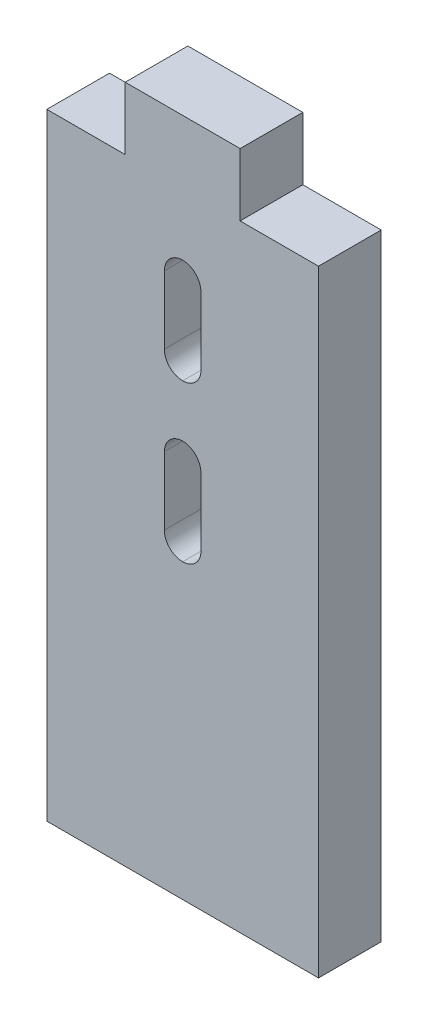
ISO-10303-21;
HEADER;
FILE_DESCRIPTION(('STEP AP214'),'2;1');
FILE_NAME('part.step','',(''),(''),'','','');
FILE_SCHEMA(('AUTOMOTIVE_DESIGN { 1 0 10303 214 1 1 1 1 }'));
ENDSEC;
DATA;
#1=APPLICATION_CONTEXT('core data for automotive mechanical design processes');
#2=APPLICATION_PROTOCOL_DEFINITION('international standard','automotive_design',2000,#1);
#3=PRODUCT_CONTEXT('',#1,'mechanical');
#4=PRODUCT('Part','Part','',(#3));
#5=PRODUCT_RELATED_PRODUCT_CATEGORY('part','',(#4));
#6=PRODUCT_DEFINITION_FORMATION('','',#4);
#7=PRODUCT_DEFINITION_CONTEXT('part definition',#1,'design');
#8=PRODUCT_DEFINITION('design','',#6,#7);
#9=PRODUCT_DEFINITION_SHAPE('','',#8);
#10=(LENGTH_UNIT() NAMED_UNIT(*) SI_UNIT(.MILLI.,.METRE.));
#11=(NAMED_UNIT(*) PLANE_ANGLE_UNIT() SI_UNIT($,.RADIAN.));
#12=(NAMED_UNIT(*) SI_UNIT($,.STERADIAN.) SOLID_ANGLE_UNIT());
#13=UNCERTAINTY_MEASURE_WITH_UNIT(LENGTH_MEASURE(1.E-05),#10,'distance_accuracy_value','');
#14=(GEOMETRIC_REPRESENTATION_CONTEXT(3) GLOBAL_UNCERTAINTY_ASSIGNED_CONTEXT((#13)) GLOBAL_UNIT_ASSIGNED_CONTEXT((#10,
#11,#12)) REPRESENTATION_CONTEXT('',''));
#15=CARTESIAN_POINT('',(0.,0.,0.));
#16=DIRECTION('',(0.,0.,1.));
#17=DIRECTION('',(1.,0.,0.));
#18=AXIS2_PLACEMENT_3D('',#15,#16,#17);
#19=CARTESIAN_POINT('',(1.75,0.,6.));
#20=DIRECTION('',(1.,0.,0.));
#21=DIRECTION('',(0.,1.,0.));
#22=AXIS2_PLACEMENT_3D('',#19,#20,#21);
#23=PLANE('',#22);
#24=DIRECTION('',(0.,-1.,0.));
#25=VECTOR('',#24,1.);
#26=CARTESIAN_POINT('',(1.75,0.,0.));
#27=LINE('',#26,#25);
#28=CARTESIAN_POINT('',(1.75,18.75,0.));
#29=VERTEX_POINT('',#28);
#30=CARTESIAN_POINT('',(1.75,12.25,0.));
#31=VERTEX_POINT('',#30);
#32=EDGE_CURVE('E250',#29,#31,#27,.T.);
#33=ORIENTED_EDGE('',*,*,#32,.T.);
#34=DIRECTION('',(0.,0.,-1.));
#35=VECTOR('',#34,1.);
#36=CARTESIAN_POINT('',(1.75,12.25,6.));
#37=LINE('',#36,#35);
#38=CARTESIAN_POINT('',(1.75,12.25,6.));
#39=VERTEX_POINT('',#38);
#40=EDGE_CURVE('E284',#31,#39,#37,.F.);
#41=ORIENTED_EDGE('',*,*,#40,.T.);
#42=DIRECTION('',(0.,-1.,0.));
#43=VECTOR('',#42,1.);
#44=CARTESIAN_POINT('',(1.75,0.,6.));
#45=LINE('',#44,#43);
#46=CARTESIAN_POINT('',(1.75,18.75,6.));
#47=VERTEX_POINT('',#46);
#48=EDGE_CURVE('E215',#47,#39,#45,.T.);
#49=ORIENTED_EDGE('',*,*,#48,.F.);
#50=DIRECTION('',(0.,0.,-1.));
#51=VECTOR('',#50,1.);
#52=CARTESIAN_POINT('',(1.75,18.75,6.));
#53=LINE('',#52,#51);
#54=EDGE_CURVE('E281',#47,#29,#53,.T.);
#55=ORIENTED_EDGE('',*,*,#54,.T.);
#56=EDGE_LOOP('',(#33,#41,#49,#55));
#57=FACE_BOUND('',#56,.T.);
#58=ADVANCED_FACE('F35',(#57),#23,.F.);
#59=CARTESIAN_POINT('',(-5.5,0.,6.));
#60=DIRECTION('',(-1.,0.,0.));
#61=DIRECTION('',(0.,0.,1.));
#62=AXIS2_PLACEMENT_3D('',#59,#60,#61);
#63=PLANE('',#62);
#64=DIRECTION('',(0.,1.,0.));
#65=VECTOR('',#64,1.);
#66=CARTESIAN_POINT('',(-5.5,0.,0.));
#67=LINE('',#66,#65);
#68=CARTESIAN_POINT('',(-5.5,26.5,0.));
#69=VERTEX_POINT('',#68);
#70=CARTESIAN_POINT('',(-5.5,32.5,0.));
#71=VERTEX_POINT('',#70);
#72=EDGE_CURVE('E178',#69,#71,#67,.T.);
#73=ORIENTED_EDGE('',*,*,#72,.F.);
#74=DIRECTION('',(0.,0.,-1.));
#75=VECTOR('',#74,1.);
#76=CARTESIAN_POINT('',(-5.5,26.5,6.));
#77=LINE('',#76,#75);
#78=CARTESIAN_POINT('',(-5.5,26.5,6.));
#79=VERTEX_POINT('',#78);
#80=EDGE_CURVE('E173',#79,#69,#77,.T.);
#81=ORIENTED_EDGE('',*,*,#80,.F.);
#82=DIRECTION('',(0.,1.,0.));
#83=VECTOR('',#82,1.);
#84=CARTESIAN_POINT('',(-5.5,0.,6.));
#85=LINE('',#84,#83);
#86=CARTESIAN_POINT('',(-5.5,32.5,6.));
#87=VERTEX_POINT('',#86);
#88=EDGE_CURVE('E176',#79,#87,#85,.T.);
#89=ORIENTED_EDGE('',*,*,#88,.T.);
#90=DIRECTION('',(0.,0.,-1.));
#91=VECTOR('',#90,1.);
#92=CARTESIAN_POINT('',(-5.5,32.5,6.));
#93=LINE('',#92,#91);
#94=EDGE_CURVE('E221',#87,#71,#93,.T.);
#95=ORIENTED_EDGE('',*,*,#94,.T.);
#96=EDGE_LOOP('',(#73,#81,#89,#95));
#97=FACE_BOUND('',#96,.T.);
#98=ADVANCED_FACE('F175',(#97),#63,.T.);
#99=CARTESIAN_POINT('',(0.,26.5,6.));
#100=DIRECTION('',(0.,1.,0.));
#101=DIRECTION('',(0.,0.,1.));
#102=AXIS2_PLACEMENT_3D('',#99,#100,#101);
#103=PLANE('',#102);
#104=DIRECTION('',(1.,0.,0.));
#105=VECTOR('',#104,1.);
#106=CARTESIAN_POINT('',(0.,26.5,0.));
#107=LINE('',#106,#105);
#108=CARTESIAN_POINT('',(-13.,26.5,0.));
#109=VERTEX_POINT('',#108);
#110=EDGE_CURVE('E230',#109,#69,#107,.T.);
#111=ORIENTED_EDGE('',*,*,#110,.F.);
#112=DIRECTION('',(0.,0.,-1.));
#113=VECTOR('',#112,1.);
#114=CARTESIAN_POINT('',(-13.,26.5,6.));
#115=LINE('',#114,#113);
#116=CARTESIAN_POINT('',(-13.,26.5,6.));
#117=VERTEX_POINT('',#116);
#118=EDGE_CURVE('E184',#117,#109,#115,.T.);
#119=ORIENTED_EDGE('',*,*,#118,.F.);
#120=DIRECTION('',(1.,0.,0.));
#121=VECTOR('',#120,1.);
#122=CARTESIAN_POINT('',(0.,26.5,6.));
#123=LINE('',#122,#121);
#124=EDGE_CURVE('E190',#117,#79,#123,.T.);
#125=ORIENTED_EDGE('',*,*,#124,.T.);
#126=ORIENTED_EDGE('',*,*,#80,.T.);
#127=EDGE_LOOP('',(#111,#119,#125,#126));
#128=FACE_BOUND('',#127,.T.);
#129=ADVANCED_FACE('F197',(#128),#103,.T.);
#130=CARTESIAN_POINT('',(-13.,0.,6.));
#131=DIRECTION('',(-1.,0.,0.));
#132=DIRECTION('',(0.,-1.,0.));
#133=AXIS2_PLACEMENT_3D('',#130,#131,#132);
#134=PLANE('',#133);
#135=DIRECTION('',(0.,1.,0.));
#136=VECTOR('',#135,1.);
#137=CARTESIAN_POINT('',(-13.,0.,0.));
#138=LINE('',#137,#136);
#139=CARTESIAN_POINT('',(-13.,-32.5,0.));
#140=VERTEX_POINT('',#139);
#141=EDGE_CURVE('E232',#140,#109,#138,.T.);
#142=ORIENTED_EDGE('',*,*,#141,.F.);
#143=DIRECTION('',(0.,0.,-1.));
#144=VECTOR('',#143,1.);
#145=CARTESIAN_POINT('',(-13.,-32.5,6.));
#146=LINE('',#145,#144);
#147=CARTESIAN_POINT('',(-13.,-32.5,6.));
#148=VERTEX_POINT('',#147);
#149=EDGE_CURVE('E269',#148,#140,#146,.T.);
#150=ORIENTED_EDGE('',*,*,#149,.F.);
#151=DIRECTION('',(0.,1.,0.));
#152=VECTOR('',#151,1.);
#153=CARTESIAN_POINT('',(-13.,0.,6.));
#154=LINE('',#153,#152);
#155=EDGE_CURVE('E198',#148,#117,#154,.T.);
#156=ORIENTED_EDGE('',*,*,#155,.T.);
#157=ORIENTED_EDGE('',*,*,#118,.T.);
#158=EDGE_LOOP('',(#142,#150,#156,#157));
#159=FACE_BOUND('',#158,.T.);
#160=ADVANCED_FACE('F388',(#159),#134,.T.);
#161=CARTESIAN_POINT('',(0.,-32.5,6.));
#162=DIRECTION('',(0.,-1.,0.));
#163=DIRECTION('',(0.,0.,-1.));
#164=AXIS2_PLACEMENT_3D('',#161,#162,#163);
#165=PLANE('',#164);
#166=DIRECTION('',(-1.,0.,0.));
#167=VECTOR('',#166,1.);
#168=CARTESIAN_POINT('',(0.,-32.5,0.));
#169=LINE('',#168,#167);
#170=CARTESIAN_POINT('',(13.,-32.5,0.));
#171=VERTEX_POINT('',#170);
#172=EDGE_CURVE('E235',#171,#140,#169,.T.);
#173=ORIENTED_EDGE('',*,*,#172,.F.);
#174=DIRECTION('',(0.,0.,-1.));
#175=VECTOR('',#174,1.);
#176=CARTESIAN_POINT('',(13.,-32.5,6.));
#177=LINE('',#176,#175);
#178=CARTESIAN_POINT('',(13.,-32.5,6.));
#179=VERTEX_POINT('',#178);
#180=EDGE_CURVE('E267',#179,#171,#177,.T.);
#181=ORIENTED_EDGE('',*,*,#180,.F.);
#182=DIRECTION('',(-1.,0.,0.));
#183=VECTOR('',#182,1.);
#184=CARTESIAN_POINT('',(0.,-32.5,6.));
#185=LINE('',#184,#183);
#186=EDGE_CURVE('E200',#179,#148,#185,.T.);
#187=ORIENTED_EDGE('',*,*,#186,.T.);
#188=ORIENTED_EDGE('',*,*,#149,.T.);
#189=EDGE_LOOP('',(#173,#181,#187,#188));
#190=FACE_BOUND('',#189,.T.);
#191=ADVANCED_FACE('F384',(#190),#165,.T.);
#192=CARTESIAN_POINT('',(13.,0.,6.));
#193=DIRECTION('',(-1.,0.,0.));
#194=DIRECTION('',(0.,-1.,0.));
#195=AXIS2_PLACEMENT_3D('',#192,#193,#194);
#196=PLANE('',#195);
#197=DIRECTION('',(0.,1.,0.));
#198=VECTOR('',#197,1.);
#199=CARTESIAN_POINT('',(13.,0.,0.));
#200=LINE('',#199,#198);
#201=CARTESIAN_POINT('',(13.,26.5,0.));
#202=VERTEX_POINT('',#201);
#203=EDGE_CURVE('E238',#171,#202,#200,.T.);
#204=ORIENTED_EDGE('',*,*,#203,.T.);
#205=DIRECTION('',(0.,0.,-1.));
#206=VECTOR('',#205,1.);
#207=CARTESIAN_POINT('',(13.,26.5,6.));
#208=LINE('',#207,#206);
#209=CARTESIAN_POINT('',(13.,26.5,6.));
#210=VERTEX_POINT('',#209);
#211=EDGE_CURVE('E264',#210,#202,#208,.T.);
#212=ORIENTED_EDGE('',*,*,#211,.F.);
#213=DIRECTION('',(0.,1.,0.));
#214=VECTOR('',#213,1.);
#215=CARTESIAN_POINT('',(13.,0.,6.));
#216=LINE('',#215,#214);
#217=EDGE_CURVE('E206',#179,#210,#216,.T.);
#218=ORIENTED_EDGE('',*,*,#217,.F.);
#219=ORIENTED_EDGE('',*,*,#180,.T.);
#220=EDGE_LOOP('',(#204,#212,#218,#219));
#221=FACE_BOUND('',#220,.T.);
#222=ADVANCED_FACE('F380',(#221),#196,.F.);
#223=CARTESIAN_POINT('',(0.,26.5,6.));
#224=DIRECTION('',(0.,-1.,0.));
#225=DIRECTION('',(1.,0.,0.));
#226=AXIS2_PLACEMENT_3D('',#223,#224,#225);
#227=PLANE('',#226);
#228=DIRECTION('',(-1.,0.,0.));
#229=VECTOR('',#228,1.);
#230=CARTESIAN_POINT('',(0.,26.5,0.));
#231=LINE('',#230,#229);
#232=CARTESIAN_POINT('',(5.5,26.5,0.));
#233=VERTEX_POINT('',#232);
#234=EDGE_CURVE('E241',#202,#233,#231,.T.);
#235=ORIENTED_EDGE('',*,*,#234,.T.);
#236=DIRECTION('',(0.,0.,-1.));
#237=VECTOR('',#236,1.);
#238=CARTESIAN_POINT('',(5.5,26.5,6.));
#239=LINE('',#238,#237);
#240=CARTESIAN_POINT('',(5.5,26.5,6.));
#241=VERTEX_POINT('',#240);
#242=EDGE_CURVE('E261',#241,#233,#239,.T.);
#243=ORIENTED_EDGE('',*,*,#242,.F.);
#244=DIRECTION('',(-1.,0.,0.));
#245=VECTOR('',#244,1.);
#246=CARTESIAN_POINT('',(0.,26.5,6.));
#247=LINE('',#246,#245);
#248=EDGE_CURVE('E209',#210,#241,#247,.T.);
#249=ORIENTED_EDGE('',*,*,#248,.F.);
#250=ORIENTED_EDGE('',*,*,#211,.T.);
#251=EDGE_LOOP('',(#235,#243,#249,#250));
#252=FACE_BOUND('',#251,.T.);
#253=ADVANCED_FACE('F376',(#252),#227,.F.);
#254=CARTESIAN_POINT('',(5.5,0.,6.));
#255=DIRECTION('',(-1.,0.,0.));
#256=DIRECTION('',(0.,0.,1.));
#257=AXIS2_PLACEMENT_3D('',#254,#255,#256);
#258=PLANE('',#257);
#259=DIRECTION('',(0.,1.,0.));
#260=VECTOR('',#259,1.);
#261=CARTESIAN_POINT('',(5.5,0.,0.));
#262=LINE('',#261,#260);
#263=CARTESIAN_POINT('',(5.5,32.5,0.));
#264=VERTEX_POINT('',#263);
#265=EDGE_CURVE('E244',#233,#264,#262,.T.);
#266=ORIENTED_EDGE('',*,*,#265,.T.);
#267=DIRECTION('',(0.,0.,-1.));
#268=VECTOR('',#267,1.);
#269=CARTESIAN_POINT('',(5.5,32.5,6.));
#270=LINE('',#269,#268);
#271=CARTESIAN_POINT('',(5.5,32.5,6.));
#272=VERTEX_POINT('',#271);
#273=EDGE_CURVE('E258',#272,#264,#270,.T.);
#274=ORIENTED_EDGE('',*,*,#273,.F.);
#275=DIRECTION('',(0.,1.,0.));
#276=VECTOR('',#275,1.);
#277=CARTESIAN_POINT('',(5.5,0.,6.));
#278=LINE('',#277,#276);
#279=EDGE_CURVE('E212',#241,#272,#278,.T.);
#280=ORIENTED_EDGE('',*,*,#279,.F.);
#281=ORIENTED_EDGE('',*,*,#242,.T.);
#282=EDGE_LOOP('',(#266,#274,#280,#281));
#283=FACE_BOUND('',#282,.T.);
#284=ADVANCED_FACE('F372',(#283),#258,.F.);
#285=CARTESIAN_POINT('',(-1.75,0.,6.));
#286=DIRECTION('',(1.,0.,0.));
#287=DIRECTION('',(0.,1.,0.));
#288=AXIS2_PLACEMENT_3D('',#285,#286,#287);
#289=PLANE('',#288);
#290=DIRECTION('',(0.,-1.,0.));
#291=VECTOR('',#290,1.);
#292=CARTESIAN_POINT('',(-1.75,0.,6.));
#293=LINE('',#292,#291);
#294=CARTESIAN_POINT('',(-1.75,3.74999999999997,6.));
#295=VERTEX_POINT('',#294);
#296=CARTESIAN_POINT('',(-1.75,-2.75000000000003,6.));
#297=VERTEX_POINT('',#296);
#298=EDGE_CURVE('E256',#295,#297,#293,.T.);
#299=ORIENTED_EDGE('',*,*,#298,.T.);
#300=DIRECTION('',(0.,0.,-1.));
#301=VECTOR('',#300,1.);
#302=CARTESIAN_POINT('',(-1.75,-2.75000000000003,6.));
#303=LINE('',#302,#301);
#304=CARTESIAN_POINT('',(-1.75,-2.75000000000003,0.));
#305=VERTEX_POINT('',#304);
#306=EDGE_CURVE('E273',#297,#305,#303,.T.);
#307=ORIENTED_EDGE('',*,*,#306,.T.);
#308=DIRECTION('',(0.,-1.,0.));
#309=VECTOR('',#308,1.);
#310=CARTESIAN_POINT('',(-1.75,0.,0.));
#311=LINE('',#310,#309);
#312=CARTESIAN_POINT('',(-1.75,3.74999999999997,0.));
#313=VERTEX_POINT('',#312);
#314=EDGE_CURVE('E222',#313,#305,#311,.T.);
#315=ORIENTED_EDGE('',*,*,#314,.F.);
#316=DIRECTION('',(0.,0.,-1.));
#317=VECTOR('',#316,1.);
#318=CARTESIAN_POINT('',(-1.75,3.74999999999997,6.));
#319=LINE('',#318,#317);
#320=EDGE_CURVE('E183',#313,#295,#319,.F.);
#321=ORIENTED_EDGE('',*,*,#320,.T.);
#322=EDGE_LOOP('',(#299,#307,#315,#321));
#323=FACE_BOUND('',#322,.T.);
#324=ADVANCED_FACE('F375',(#323),#289,.T.);
#325=CARTESIAN_POINT('',(1.75000000000001,0.,6.));
#326=DIRECTION('',(1.,0.,0.));
#327=DIRECTION('',(0.,1.,0.));
#328=AXIS2_PLACEMENT_3D('',#325,#326,#327);
#329=PLANE('',#328);
#330=DIRECTION('',(0.,-1.,0.));
#331=VECTOR('',#330,1.);
#332=CARTESIAN_POINT('',(1.75000000000001,0.,0.));
#333=LINE('',#332,#331);
#334=CARTESIAN_POINT('',(1.75000000000001,3.74999999999997,0.));
#335=VERTEX_POINT('',#334);
#336=CARTESIAN_POINT('',(1.75000000000001,-2.75000000000003,0.));
#337=VERTEX_POINT('',#336);
#338=EDGE_CURVE('E225',#335,#337,#333,.T.);
#339=ORIENTED_EDGE('',*,*,#338,.T.);
#340=DIRECTION('',(0.,0.,-1.));
#341=VECTOR('',#340,1.);
#342=CARTESIAN_POINT('',(1.75000000000001,-2.75000000000003,6.));
#343=LINE('',#342,#341);
#344=CARTESIAN_POINT('',(1.75000000000001,-2.75000000000003,6.));
#345=VERTEX_POINT('',#344);
#346=EDGE_CURVE('E279',#337,#345,#343,.F.);
#347=ORIENTED_EDGE('',*,*,#346,.T.);
#348=DIRECTION('',(0.,-1.,0.));
#349=VECTOR('',#348,1.);
#350=CARTESIAN_POINT('',(1.75000000000001,0.,6.));
#351=LINE('',#350,#349);
#352=CARTESIAN_POINT('',(1.75000000000001,3.74999999999997,6.));
#353=VERTEX_POINT('',#352);
#354=EDGE_CURVE('E195',#353,#345,#351,.T.);
#355=ORIENTED_EDGE('',*,*,#354,.F.);
#356=DIRECTION('',(0.,0.,-1.));
#357=VECTOR('',#356,1.);
#358=CARTESIAN_POINT('',(1.75000000000001,3.74999999999997,6.));
#359=LINE('',#358,#357);
#360=EDGE_CURVE('E276',#353,#335,#359,.T.);
#361=ORIENTED_EDGE('',*,*,#360,.T.);
#362=EDGE_LOOP('',(#339,#347,#355,#361));
#363=FACE_BOUND('',#362,.T.);
#364=ADVANCED_FACE('F370',(#363),#329,.F.);
#365=CARTESIAN_POINT('',(0.,32.5,6.));
#366=DIRECTION('',(0.,-1.,0.));
#367=DIRECTION('',(0.,0.,-1.));
#368=AXIS2_PLACEMENT_3D('',#365,#366,#367);
#369=PLANE('',#368);
#370=DIRECTION('',(-1.,0.,0.));
#371=VECTOR('',#370,1.);
#372=CARTESIAN_POINT('',(0.,32.5,0.));
#373=LINE('',#372,#371);
#374=EDGE_CURVE('E247',#264,#71,#373,.T.);
#375=ORIENTED_EDGE('',*,*,#374,.T.);
#376=ORIENTED_EDGE('',*,*,#94,.F.);
#377=DIRECTION('',(-1.,0.,0.));
#378=VECTOR('',#377,1.);
#379=CARTESIAN_POINT('',(0.,32.5,6.));
#380=LINE('',#379,#378);
#381=EDGE_CURVE('E193',#272,#87,#380,.T.);
#382=ORIENTED_EDGE('',*,*,#381,.F.);
#383=ORIENTED_EDGE('',*,*,#273,.T.);
#384=EDGE_LOOP('',(#375,#376,#382,#383));
#385=FACE_BOUND('',#384,.T.);
#386=ADVANCED_FACE('F358',(#385),#369,.F.);
#387=CARTESIAN_POINT('',(-1.75,0.,6.));
#388=DIRECTION('',(1.,0.,0.));
#389=DIRECTION('',(0.,1.,0.));
#390=AXIS2_PLACEMENT_3D('',#387,#388,#389);
#391=PLANE('',#390);
#392=DIRECTION('',(0.,-1.,0.));
#393=VECTOR('',#392,1.);
#394=CARTESIAN_POINT('',(-1.75,0.,6.));
#395=LINE('',#394,#393);
#396=CARTESIAN_POINT('',(-1.75,18.75,6.));
#397=VERTEX_POINT('',#396);
#398=CARTESIAN_POINT('',(-1.75,12.25,6.));
#399=VERTEX_POINT('',#398);
#400=EDGE_CURVE('E218',#397,#399,#395,.T.);
#401=ORIENTED_EDGE('',*,*,#400,.T.);
#402=DIRECTION('',(0.,0.,-1.));
#403=VECTOR('',#402,1.);
#404=CARTESIAN_POINT('',(-1.75,12.25,6.));
#405=LINE('',#404,#403);
#406=CARTESIAN_POINT('',(-1.75,12.25,0.));
#407=VERTEX_POINT('',#406);
#408=EDGE_CURVE('E289',#399,#407,#405,.T.);
#409=ORIENTED_EDGE('',*,*,#408,.T.);
#410=DIRECTION('',(0.,-1.,0.));
#411=VECTOR('',#410,1.);
#412=CARTESIAN_POINT('',(-1.75,0.,0.));
#413=LINE('',#412,#411);
#414=CARTESIAN_POINT('',(-1.75,18.75,0.));
#415=VERTEX_POINT('',#414);
#416=EDGE_CURVE('E253',#415,#407,#413,.T.);
#417=ORIENTED_EDGE('',*,*,#416,.F.);
#418=DIRECTION('',(0.,0.,-1.));
#419=VECTOR('',#418,1.);
#420=CARTESIAN_POINT('',(-1.75,18.75,6.));
#421=LINE('',#420,#419);
#422=EDGE_CURVE('E287',#415,#397,#421,.F.);
#423=ORIENTED_EDGE('',*,*,#422,.T.);
#424=EDGE_LOOP('',(#401,#409,#417,#423));
#425=FACE_BOUND('',#424,.T.);
#426=ADVANCED_FACE('F339',(#425),#391,.T.);
#427=CARTESIAN_POINT('',(0.,0.,6.));
#428=DIRECTION('',(0.,0.,1.));
#429=DIRECTION('',(1.,0.,0.));
#430=AXIS2_PLACEMENT_3D('',#427,#428,#429);
#431=PLANE('',#430);
#432=ORIENTED_EDGE('',*,*,#298,.F.);
#433=CARTESIAN_POINT('',(0.,3.74999999999997,6.));
#434=DIRECTION('',(0.,0.,1.));
#435=DIRECTION('',(1.,0.,0.));
#436=AXIS2_PLACEMENT_3D('',#433,#434,#435);
#437=CIRCLE('',#436,1.75);
#438=CARTESIAN_POINT('',(0.,5.49999999999997,6.));
#439=VERTEX_POINT('',#438);
#440=EDGE_CURVE('E305',#295,#439,#437,.F.);
#441=ORIENTED_EDGE('',*,*,#440,.T.);
#442=CARTESIAN_POINT('',(0.,3.74999999999997,6.));
#443=DIRECTION('',(0.,0.,1.));
#444=DIRECTION('',(1.,0.,0.));
#445=AXIS2_PLACEMENT_3D('',#442,#443,#444);
#446=CIRCLE('',#445,1.75);
#447=EDGE_CURVE('E301',#439,#353,#446,.F.);
#448=ORIENTED_EDGE('',*,*,#447,.T.);
#449=ORIENTED_EDGE('',*,*,#354,.T.);
#450=CARTESIAN_POINT('',(0.,-2.75000000000003,6.));
#451=DIRECTION('',(0.,0.,1.));
#452=DIRECTION('',(1.,0.,0.));
#453=AXIS2_PLACEMENT_3D('',#450,#451,#452);
#454=CIRCLE('',#453,1.75);
#455=CARTESIAN_POINT('',(0.,-4.50000000000003,6.));
#456=VERTEX_POINT('',#455);
#457=EDGE_CURVE('E297',#345,#456,#454,.F.);
#458=ORIENTED_EDGE('',*,*,#457,.T.);
#459=CARTESIAN_POINT('',(0.,-2.75000000000003,6.));
#460=DIRECTION('',(0.,0.,1.));
#461=DIRECTION('',(1.,0.,0.));
#462=AXIS2_PLACEMENT_3D('',#459,#460,#461);
#463=CIRCLE('',#462,1.75);
#464=EDGE_CURVE('E293',#456,#297,#463,.F.);
#465=ORIENTED_EDGE('',*,*,#464,.T.);
#466=EDGE_LOOP('',(#432,#441,#448,#449,#458,#465));
#467=FACE_BOUND('',#466,.T.);
#468=ORIENTED_EDGE('',*,*,#88,.F.);
#469=ORIENTED_EDGE('',*,*,#124,.F.);
#470=ORIENTED_EDGE('',*,*,#155,.F.);
#471=ORIENTED_EDGE('',*,*,#186,.F.);
#472=ORIENTED_EDGE('',*,*,#217,.T.);
#473=ORIENTED_EDGE('',*,*,#248,.T.);
#474=ORIENTED_EDGE('',*,*,#279,.T.);
#475=ORIENTED_EDGE('',*,*,#381,.T.);
#476=EDGE_LOOP('',(#468,#469,#470,#471,#472,#473,#474,#475));
#477=FACE_BOUND('',#476,.T.);
#478=ORIENTED_EDGE('',*,*,#400,.F.);
#479=CARTESIAN_POINT('',(0.,18.75,6.));
#480=DIRECTION('',(0.,0.,1.));
#481=DIRECTION('',(1.,0.,0.));
#482=AXIS2_PLACEMENT_3D('',#479,#480,#481);
#483=CIRCLE('',#482,1.75);
#484=CARTESIAN_POINT('',(0.,20.5,6.));
#485=VERTEX_POINT('',#484);
#486=EDGE_CURVE('E11',#397,#485,#483,.F.);
#487=ORIENTED_EDGE('',*,*,#486,.T.);
#488=CARTESIAN_POINT('',(0.,18.75,6.));
#489=DIRECTION('',(0.,0.,1.));
#490=DIRECTION('',(1.,0.,0.));
#491=AXIS2_PLACEMENT_3D('',#488,#489,#490);
#492=CIRCLE('',#491,1.75);
#493=EDGE_CURVE('E316',#485,#47,#492,.F.);
#494=ORIENTED_EDGE('',*,*,#493,.T.);
#495=ORIENTED_EDGE('',*,*,#48,.T.);
#496=CARTESIAN_POINT('',(0.,12.25,6.));
#497=DIRECTION('',(0.,0.,1.));
#498=DIRECTION('',(1.,0.,0.));
#499=AXIS2_PLACEMENT_3D('',#496,#497,#498);
#500=CIRCLE('',#499,1.75);
#501=CARTESIAN_POINT('',(0.,10.5,6.));
#502=VERTEX_POINT('',#501);
#503=EDGE_CURVE('E309',#39,#502,#500,.F.);
#504=ORIENTED_EDGE('',*,*,#503,.T.);
#505=CARTESIAN_POINT('',(0.,12.25,6.));
#506=DIRECTION('',(0.,0.,1.));
#507=DIRECTION('',(1.,0.,0.));
#508=AXIS2_PLACEMENT_3D('',#505,#506,#507);
#509=CIRCLE('',#508,1.75);
#510=EDGE_CURVE('E313',#502,#399,#509,.F.);
#511=ORIENTED_EDGE('',*,*,#510,.T.);
#512=EDGE_LOOP('',(#478,#487,#494,#495,#504,#511));
#513=FACE_BOUND('',#512,.T.);
#514=ADVANCED_FACE('F188',(#467,#477,#513),#431,.T.);
#515=CARTESIAN_POINT('',(0.,0.,0.));
#516=DIRECTION('',(0.,0.,1.));
#517=DIRECTION('',(1.,0.,0.));
#518=AXIS2_PLACEMENT_3D('',#515,#516,#517);
#519=PLANE('',#518);
#520=CARTESIAN_POINT('',(0.,3.74999999999997,0.));
#521=DIRECTION('',(0.,0.,1.));
#522=DIRECTION('',(1.,0.,0.));
#523=AXIS2_PLACEMENT_3D('',#520,#521,#522);
#524=CIRCLE('',#523,1.75);
#525=CARTESIAN_POINT('',(0.,5.49999999999997,0.));
#526=VERTEX_POINT('',#525);
#527=EDGE_CURVE('E299',#335,#526,#524,.T.);
#528=ORIENTED_EDGE('',*,*,#527,.T.);
#529=CARTESIAN_POINT('',(0.,3.74999999999997,0.));
#530=DIRECTION('',(0.,0.,1.));
#531=DIRECTION('',(1.,0.,0.));
#532=AXIS2_PLACEMENT_3D('',#529,#530,#531);
#533=CIRCLE('',#532,1.75);
#534=EDGE_CURVE('E303',#526,#313,#533,.T.);
#535=ORIENTED_EDGE('',*,*,#534,.T.);
#536=ORIENTED_EDGE('',*,*,#314,.T.);
#537=CARTESIAN_POINT('',(0.,-2.75000000000003,0.));
#538=DIRECTION('',(0.,0.,1.));
#539=DIRECTION('',(1.,0.,0.));
#540=AXIS2_PLACEMENT_3D('',#537,#538,#539);
#541=CIRCLE('',#540,1.75);
#542=CARTESIAN_POINT('',(0.,-4.50000000000003,0.));
#543=VERTEX_POINT('',#542);
#544=EDGE_CURVE('E291',#305,#543,#541,.T.);
#545=ORIENTED_EDGE('',*,*,#544,.T.);
#546=CARTESIAN_POINT('',(0.,-2.75000000000003,0.));
#547=DIRECTION('',(0.,0.,1.));
#548=DIRECTION('',(1.,0.,0.));
#549=AXIS2_PLACEMENT_3D('',#546,#547,#548);
#550=CIRCLE('',#549,1.75);
#551=EDGE_CURVE('E295',#543,#337,#550,.T.);
#552=ORIENTED_EDGE('',*,*,#551,.T.);
#553=ORIENTED_EDGE('',*,*,#338,.F.);
#554=EDGE_LOOP('',(#528,#535,#536,#545,#552,#553));
#555=FACE_BOUND('',#554,.T.);
#556=ORIENTED_EDGE('',*,*,#72,.T.);
#557=ORIENTED_EDGE('',*,*,#374,.F.);
#558=ORIENTED_EDGE('',*,*,#265,.F.);
#559=ORIENTED_EDGE('',*,*,#234,.F.);
#560=ORIENTED_EDGE('',*,*,#203,.F.);
#561=ORIENTED_EDGE('',*,*,#172,.T.);
#562=ORIENTED_EDGE('',*,*,#141,.T.);
#563=ORIENTED_EDGE('',*,*,#110,.T.);
#564=EDGE_LOOP('',(#556,#557,#558,#559,#560,#561,#562,#563));
#565=FACE_BOUND('',#564,.T.);
#566=CARTESIAN_POINT('',(0.,18.75,0.));
#567=DIRECTION('',(0.,0.,1.));
#568=DIRECTION('',(1.,0.,0.));
#569=AXIS2_PLACEMENT_3D('',#566,#567,#568);
#570=CIRCLE('',#569,1.75);
#571=CARTESIAN_POINT('',(0.,20.5,0.));
#572=VERTEX_POINT('',#571);
#573=EDGE_CURVE('E58',#29,#572,#570,.T.);
#574=ORIENTED_EDGE('',*,*,#573,.T.);
#575=CARTESIAN_POINT('',(0.,18.75,0.));
#576=DIRECTION('',(0.,0.,1.));
#577=DIRECTION('',(1.,0.,0.));
#578=AXIS2_PLACEMENT_3D('',#575,#576,#577);
#579=CIRCLE('',#578,1.75);
#580=EDGE_CURVE('E44',#572,#415,#579,.T.);
#581=ORIENTED_EDGE('',*,*,#580,.T.);
#582=ORIENTED_EDGE('',*,*,#416,.T.);
#583=CARTESIAN_POINT('',(0.,12.25,0.));
#584=DIRECTION('',(0.,0.,1.));
#585=DIRECTION('',(1.,0.,0.));
#586=AXIS2_PLACEMENT_3D('',#583,#584,#585);
#587=CIRCLE('',#586,1.75);
#588=CARTESIAN_POINT('',(0.,10.5,0.));
#589=VERTEX_POINT('',#588);
#590=EDGE_CURVE('E311',#407,#589,#587,.T.);
#591=ORIENTED_EDGE('',*,*,#590,.T.);
#592=CARTESIAN_POINT('',(0.,12.25,0.));
#593=DIRECTION('',(0.,0.,1.));
#594=DIRECTION('',(1.,0.,0.));
#595=AXIS2_PLACEMENT_3D('',#592,#593,#594);
#596=CIRCLE('',#595,1.75);
#597=EDGE_CURVE('E307',#589,#31,#596,.T.);
#598=ORIENTED_EDGE('',*,*,#597,.T.);
#599=ORIENTED_EDGE('',*,*,#32,.F.);
#600=EDGE_LOOP('',(#574,#581,#582,#591,#598,#599));
#601=FACE_BOUND('',#600,.T.);
#602=ADVANCED_FACE('F336',(#555,#565,#601),#519,.F.);
#603=CARTESIAN_POINT('',(0.,-2.75000000000003,6.));
#604=DIRECTION('',(0.,0.,1.));
#605=DIRECTION('',(1.,0.,0.));
#606=AXIS2_PLACEMENT_3D('',#603,#604,#605);
#607=CYLINDRICAL_SURFACE('',#606,1.75);
#608=DIRECTION('',(0.,0.,-1.));
#609=VECTOR('',#608,1.);
#610=CARTESIAN_POINT('',(0.,-4.50000000000003,0.));
#611=LINE('',#610,#609);
#612=EDGE_CURVE('E226',#456,#543,#611,.T.);
#613=ORIENTED_EDGE('',*,*,#612,.F.);
#614=ORIENTED_EDGE('',*,*,#457,.F.);
#615=ORIENTED_EDGE('',*,*,#346,.F.);
#616=ORIENTED_EDGE('',*,*,#551,.F.);
#617=EDGE_LOOP('',(#613,#614,#615,#616));
#618=FACE_BOUND('',#617,.T.);
#619=ADVANCED_FACE('F355',(#618),#607,.F.);
#620=CARTESIAN_POINT('',(0.,-2.75000000000003,6.));
#621=DIRECTION('',(0.,0.,-1.));
#622=DIRECTION('',(-1.,0.,0.));
#623=AXIS2_PLACEMENT_3D('',#620,#621,#622);
#624=CYLINDRICAL_SURFACE('',#623,1.75);
#625=ORIENTED_EDGE('',*,*,#464,.F.);
#626=ORIENTED_EDGE('',*,*,#612,.T.);
#627=ORIENTED_EDGE('',*,*,#544,.F.);
#628=ORIENTED_EDGE('',*,*,#306,.F.);
#629=EDGE_LOOP('',(#625,#626,#627,#628));
#630=FACE_BOUND('',#629,.T.);
#631=ADVANCED_FACE('F401',(#630),#624,.F.);
#632=CARTESIAN_POINT('',(0.,3.74999999999997,6.));
#633=DIRECTION('',(0.,0.,1.));
#634=DIRECTION('',(1.,0.,0.));
#635=AXIS2_PLACEMENT_3D('',#632,#633,#634);
#636=CYLINDRICAL_SURFACE('',#635,1.75);
#637=DIRECTION('',(0.,0.,-1.));
#638=VECTOR('',#637,1.);
#639=CARTESIAN_POINT('',(0.,5.49999999999997,0.));
#640=LINE('',#639,#638);
#641=EDGE_CURVE('E321',#439,#526,#640,.T.);
#642=ORIENTED_EDGE('',*,*,#641,.F.);
#643=ORIENTED_EDGE('',*,*,#440,.F.);
#644=ORIENTED_EDGE('',*,*,#320,.F.);
#645=ORIENTED_EDGE('',*,*,#534,.F.);
#646=EDGE_LOOP('',(#642,#643,#644,#645));
#647=FACE_BOUND('',#646,.T.);
#648=ADVANCED_FACE('F404',(#647),#636,.F.);
#649=CARTESIAN_POINT('',(0.,3.74999999999997,6.));
#650=DIRECTION('',(0.,0.,-1.));
#651=DIRECTION('',(-1.,0.,0.));
#652=AXIS2_PLACEMENT_3D('',#649,#650,#651);
#653=CYLINDRICAL_SURFACE('',#652,1.75);
#654=ORIENTED_EDGE('',*,*,#447,.F.);
#655=ORIENTED_EDGE('',*,*,#641,.T.);
#656=ORIENTED_EDGE('',*,*,#527,.F.);
#657=ORIENTED_EDGE('',*,*,#360,.F.);
#658=EDGE_LOOP('',(#654,#655,#656,#657));
#659=FACE_BOUND('',#658,.T.);
#660=ADVANCED_FACE('F409',(#659),#653,.F.);
#661=CARTESIAN_POINT('',(0.,12.25,6.));
#662=DIRECTION('',(0.,0.,-1.));
#663=DIRECTION('',(-1.,0.,0.));
#664=AXIS2_PLACEMENT_3D('',#661,#662,#663);
#665=CYLINDRICAL_SURFACE('',#664,1.75);
#666=ORIENTED_EDGE('',*,*,#408,.F.);
#667=ORIENTED_EDGE('',*,*,#510,.F.);
#668=DIRECTION('',(0.,0.,-1.));
#669=VECTOR('',#668,1.);
#670=CARTESIAN_POINT('',(0.,10.5,6.));
#671=LINE('',#670,#669);
#672=EDGE_CURVE('E323',#589,#502,#671,.F.);
#673=ORIENTED_EDGE('',*,*,#672,.F.);
#674=ORIENTED_EDGE('',*,*,#590,.F.);
#675=EDGE_LOOP('',(#666,#667,#673,#674));
#676=FACE_BOUND('',#675,.T.);
#677=ADVANCED_FACE('F343',(#676),#665,.F.);
#678=CARTESIAN_POINT('',(0.,12.25,6.));
#679=DIRECTION('',(0.,0.,1.));
#680=DIRECTION('',(1.,0.,0.));
#681=AXIS2_PLACEMENT_3D('',#678,#679,#680);
#682=CYLINDRICAL_SURFACE('',#681,1.75);
#683=ORIENTED_EDGE('',*,*,#503,.F.);
#684=ORIENTED_EDGE('',*,*,#40,.F.);
#685=ORIENTED_EDGE('',*,*,#597,.F.);
#686=ORIENTED_EDGE('',*,*,#672,.T.);
#687=EDGE_LOOP('',(#683,#684,#685,#686));
#688=FACE_BOUND('',#687,.T.);
#689=ADVANCED_FACE('F347',(#688),#682,.F.);
#690=CARTESIAN_POINT('',(0.,18.75,6.));
#691=DIRECTION('',(0.,0.,1.));
#692=DIRECTION('',(1.,0.,0.));
#693=AXIS2_PLACEMENT_3D('',#690,#691,#692);
#694=CYLINDRICAL_SURFACE('',#693,1.75);
#695=DIRECTION('',(0.,0.,-1.));
#696=VECTOR('',#695,1.);
#697=CARTESIAN_POINT('',(0.,20.5,0.));
#698=LINE('',#697,#696);
#699=EDGE_CURVE('E39',#485,#572,#698,.T.);
#700=ORIENTED_EDGE('',*,*,#699,.F.);
#701=ORIENTED_EDGE('',*,*,#486,.F.);
#702=ORIENTED_EDGE('',*,*,#422,.F.);
#703=ORIENTED_EDGE('',*,*,#580,.F.);
#704=EDGE_LOOP('',(#700,#701,#702,#703));
#705=FACE_BOUND('',#704,.T.);
#706=ADVANCED_FACE('F37',(#705),#694,.F.);
#707=CARTESIAN_POINT('',(0.,18.75,6.));
#708=DIRECTION('',(0.,0.,-1.));
#709=DIRECTION('',(-1.,0.,0.));
#710=AXIS2_PLACEMENT_3D('',#707,#708,#709);
#711=CYLINDRICAL_SURFACE('',#710,1.75);
#712=ORIENTED_EDGE('',*,*,#493,.F.);
#713=ORIENTED_EDGE('',*,*,#699,.T.);
#714=ORIENTED_EDGE('',*,*,#573,.F.);
#715=ORIENTED_EDGE('',*,*,#54,.F.);
#716=EDGE_LOOP('',(#712,#713,#714,#715));
#717=FACE_BOUND('',#716,.T.);
#718=ADVANCED_FACE('F331',(#717),#711,.F.);
#719=CLOSED_SHELL('',(#58,#98,#129,#160,#191,#222,#253,#284,#324,#364,#386,#426,#514,#602,#619,
#631,#648,#660,#677,#689,#706,#718));
#720=MANIFOLD_SOLID_BREP('B2',#719);
#721=ADVANCED_BREP_SHAPE_REPRESENTATION('',(#18,#720),#14);
#722=SHAPE_DEFINITION_REPRESENTATION(#9,#721);
ENDSEC;
END-ISO-10303-21;
